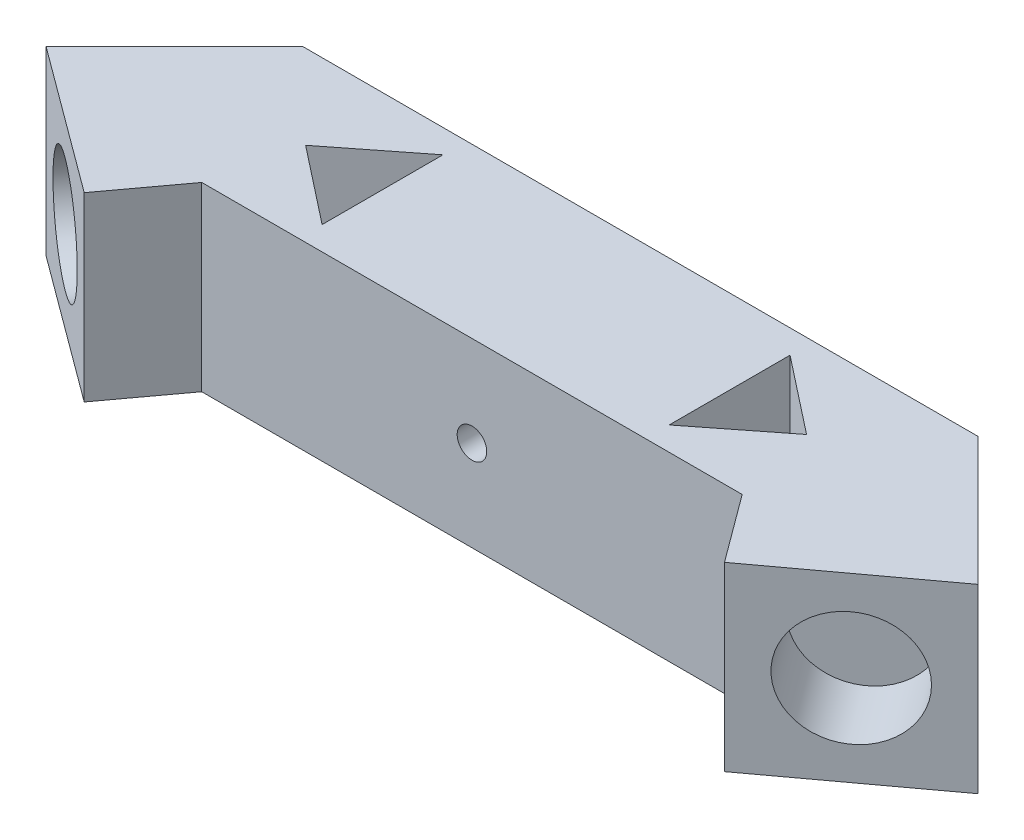
ISO-10303-21;
HEADER;
FILE_DESCRIPTION(('STEP AP214'),'2;1');
FILE_NAME('part.step','',(''),(''),'','','');
FILE_SCHEMA(('AUTOMOTIVE_DESIGN { 1 0 10303 214 1 1 1 1 }'));
ENDSEC;
DATA;
#1=APPLICATION_CONTEXT('core data for automotive mechanical design processes');
#2=APPLICATION_PROTOCOL_DEFINITION('international standard','automotive_design',2000,#1);
#3=PRODUCT_CONTEXT('',#1,'mechanical');
#4=PRODUCT('Part','Part','',(#3));
#5=PRODUCT_RELATED_PRODUCT_CATEGORY('part','',(#4));
#6=PRODUCT_DEFINITION_FORMATION('','',#4);
#7=PRODUCT_DEFINITION_CONTEXT('part definition',#1,'design');
#8=PRODUCT_DEFINITION('design','',#6,#7);
#9=PRODUCT_DEFINITION_SHAPE('','',#8);
#10=(LENGTH_UNIT() NAMED_UNIT(*) SI_UNIT(.MILLI.,.METRE.));
#11=(NAMED_UNIT(*) PLANE_ANGLE_UNIT() SI_UNIT($,.RADIAN.));
#12=(NAMED_UNIT(*) SI_UNIT($,.STERADIAN.) SOLID_ANGLE_UNIT());
#13=UNCERTAINTY_MEASURE_WITH_UNIT(LENGTH_MEASURE(1.E-05),#10,'distance_accuracy_value','');
#14=(GEOMETRIC_REPRESENTATION_CONTEXT(3) GLOBAL_UNCERTAINTY_ASSIGNED_CONTEXT((#13)) GLOBAL_UNIT_ASSIGNED_CONTEXT((#10,
#11,#12)) REPRESENTATION_CONTEXT('',''));
#15=CARTESIAN_POINT('',(0.,0.,0.));
#16=DIRECTION('',(0.,0.,1.));
#17=DIRECTION('',(1.,0.,0.));
#18=AXIS2_PLACEMENT_3D('',#15,#16,#17);
#19=CARTESIAN_POINT('',(0.,38.1,0.));
#20=DIRECTION('',(-0.804595975883322,0.,-0.593822629740873));
#21=DIRECTION('',(-0.593822629740873,0.,0.804595975883322));
#22=AXIS2_PLACEMENT_3D('',#19,#20,#21);
#23=PLANE('',#22);
#24=DIRECTION('',(0.593822629740873,0.,-0.804595975883322));
#25=VECTOR('',#24,1.);
#26=CARTESIAN_POINT('',(0.,0.,0.));
#27=LINE('',#26,#25);
#28=CARTESIAN_POINT('',(-10.4888287779957,0.,14.2117679654397));
#29=VERTEX_POINT('',#28);
#30=CARTESIAN_POINT('',(0.,0.,0.));
#31=VERTEX_POINT('',#30);
#32=EDGE_CURVE('E232',#29,#31,#27,.T.);
#33=ORIENTED_EDGE('',*,*,#32,.T.);
#34=DIRECTION('',(0.,-1.,0.));
#35=VECTOR('',#34,1.);
#36=CARTESIAN_POINT('',(0.,38.1,0.));
#37=LINE('',#36,#35);
#38=CARTESIAN_POINT('',(0.,38.1,0.));
#39=VERTEX_POINT('',#38);
#40=EDGE_CURVE('E11',#39,#31,#37,.T.);
#41=ORIENTED_EDGE('',*,*,#40,.F.);
#42=DIRECTION('',(0.593822629740873,0.,-0.804595975883322));
#43=VECTOR('',#42,1.);
#44=CARTESIAN_POINT('',(0.,38.1,0.));
#45=LINE('',#44,#43);
#46=CARTESIAN_POINT('',(-10.4888287779957,38.1,14.2117679654397));
#47=VERTEX_POINT('',#46);
#48=EDGE_CURVE('E236',#47,#39,#45,.T.);
#49=ORIENTED_EDGE('',*,*,#48,.F.);
#50=DIRECTION('',(0.,-1.,0.));
#51=VECTOR('',#50,1.);
#52=CARTESIAN_POINT('',(-10.4888287779957,38.1,14.2117679654397));
#53=LINE('',#52,#51);
#54=EDGE_CURVE('E262',#47,#29,#53,.T.);
#55=ORIENTED_EDGE('',*,*,#54,.T.);
#56=EDGE_LOOP('',(#33,#41,#49,#55));
#57=FACE_BOUND('',#56,.T.);
#58=ADVANCED_FACE('F45',(#57),#23,.F.);
#59=CARTESIAN_POINT('',(0.,38.1,0.));
#60=DIRECTION('',(0.,0.,-1.));
#61=DIRECTION('',(-1.,0.,0.));
#62=AXIS2_PLACEMENT_3D('',#59,#60,#61);
#63=PLANE('',#62);
#64=CARTESIAN_POINT('',(56.7898329040574,19.05,0.));
#65=DIRECTION('',(0.,0.,-1.));
#66=DIRECTION('',(-1.,0.,0.));
#67=AXIS2_PLACEMENT_3D('',#64,#65,#66);
#68=CIRCLE('',#67,3.1115);
#69=CARTESIAN_POINT('',(53.6783329040574,19.05,0.));
#70=VERTEX_POINT('',#69);
#71=EDGE_CURVE('E174',#70,#70,#68,.T.);
#72=ORIENTED_EDGE('',*,*,#71,.T.);
#73=EDGE_LOOP('',(#72));
#74=FACE_BOUND('',#73,.T.);
#75=DIRECTION('',(1.,0.,0.));
#76=VECTOR('',#75,1.);
#77=CARTESIAN_POINT('',(0.,0.,0.));
#78=LINE('',#77,#76);
#79=CARTESIAN_POINT('',(113.579665808115,0.,0.));
#80=VERTEX_POINT('',#79);
#81=EDGE_CURVE('E266',#31,#80,#78,.T.);
#82=ORIENTED_EDGE('',*,*,#81,.T.);
#83=DIRECTION('',(0.,-1.,0.));
#84=VECTOR('',#83,1.);
#85=CARTESIAN_POINT('',(113.579665808115,38.1,0.));
#86=LINE('',#85,#84);
#87=CARTESIAN_POINT('',(113.579665808115,38.1,0.));
#88=VERTEX_POINT('',#87);
#89=EDGE_CURVE('E53',#88,#80,#86,.T.);
#90=ORIENTED_EDGE('',*,*,#89,.F.);
#91=DIRECTION('',(1.,0.,0.));
#92=VECTOR('',#91,1.);
#93=CARTESIAN_POINT('',(0.,38.1,0.));
#94=LINE('',#93,#92);
#95=EDGE_CURVE('E240',#39,#88,#94,.T.);
#96=ORIENTED_EDGE('',*,*,#95,.F.);
#97=ORIENTED_EDGE('',*,*,#40,.T.);
#98=EDGE_LOOP('',(#82,#90,#96,#97));
#99=FACE_BOUND('',#98,.T.);
#100=ADVANCED_FACE('F336',(#74,#99),#63,.F.);
#101=CARTESIAN_POINT('',(113.579665808115,38.1,0.));
#102=DIRECTION('',(0.804595975883322,0.,-0.593822629740872));
#103=DIRECTION('',(-0.593822629740872,0.,-0.804595975883322));
#104=AXIS2_PLACEMENT_3D('',#101,#102,#103);
#105=PLANE('',#104);
#106=DIRECTION('',(0.593822629740872,0.,0.804595975883322));
#107=VECTOR('',#106,1.);
#108=CARTESIAN_POINT('',(113.579665808115,0.,0.));
#109=LINE('',#108,#107);
#110=CARTESIAN_POINT('',(124.06849458611,0.,14.2117679654397));
#111=VERTEX_POINT('',#110);
#112=EDGE_CURVE('E269',#80,#111,#109,.T.);
#113=ORIENTED_EDGE('',*,*,#112,.T.);
#114=DIRECTION('',(0.,-1.,0.));
#115=VECTOR('',#114,1.);
#116=CARTESIAN_POINT('',(124.06849458611,38.1,14.2117679654397));
#117=LINE('',#116,#115);
#118=CARTESIAN_POINT('',(124.06849458611,38.1,14.2117679654397));
#119=VERTEX_POINT('',#118);
#120=EDGE_CURVE('E305',#119,#111,#117,.T.);
#121=ORIENTED_EDGE('',*,*,#120,.F.);
#122=DIRECTION('',(0.593822629740872,0.,0.804595975883322));
#123=VECTOR('',#122,1.);
#124=CARTESIAN_POINT('',(113.579665808115,38.1,0.));
#125=LINE('',#124,#123);
#126=EDGE_CURVE('E244',#88,#119,#125,.T.);
#127=ORIENTED_EDGE('',*,*,#126,.F.);
#128=ORIENTED_EDGE('',*,*,#89,.T.);
#129=EDGE_LOOP('',(#113,#121,#127,#128));
#130=FACE_BOUND('',#129,.T.);
#131=ADVANCED_FACE('F314',(#130),#105,.F.);
#132=CARTESIAN_POINT('',(154.723601267265,38.1,-8.41287422768753));
#133=DIRECTION('',(-0.593822629740873,0.,-0.804595975883321));
#134=DIRECTION('',(-0.804595975883321,0.,0.593822629740873));
#135=AXIS2_PLACEMENT_3D('',#132,#133,#134);
#136=PLANE('',#135);
#137=CARTESIAN_POINT('',(139.396047926688,19.05,2.8994468688761));
#138=DIRECTION('',(0.593822629740873,0.,0.804595975883321));
#139=DIRECTION('',(0.804595975883321,0.,-0.593822629740873));
#140=AXIS2_PLACEMENT_3D('',#137,#138,#139);
#141=CIRCLE('',#140,12.065);
#142=CARTESIAN_POINT('',(149.10349837572,19.05,-4.26502315894755));
#143=VERTEX_POINT('',#142);
#144=EDGE_CURVE('E186',#143,#143,#141,.T.);
#145=ORIENTED_EDGE('',*,*,#144,.F.);
#146=EDGE_LOOP('',(#145));
#147=FACE_BOUND('',#146,.T.);
#148=DIRECTION('',(0.804595975883321,0.,-0.593822629740873));
#149=VECTOR('',#148,1.);
#150=CARTESIAN_POINT('',(154.723601267265,0.,-8.41287422768753));
#151=LINE('',#150,#149);
#152=CARTESIAN_POINT('',(154.723601267265,0.,-8.41287422768753));
#153=VERTEX_POINT('',#152);
#154=EDGE_CURVE('E272',#111,#153,#151,.T.);
#155=ORIENTED_EDGE('',*,*,#154,.T.);
#156=DIRECTION('',(0.,-1.,0.));
#157=VECTOR('',#156,1.);
#158=CARTESIAN_POINT('',(154.723601267265,38.1,-8.41287422768753));
#159=LINE('',#158,#157);
#160=CARTESIAN_POINT('',(154.723601267265,38.1,-8.41287422768753));
#161=VERTEX_POINT('',#160);
#162=EDGE_CURVE('E301',#161,#153,#159,.T.);
#163=ORIENTED_EDGE('',*,*,#162,.F.);
#164=DIRECTION('',(0.804595975883321,0.,-0.593822629740873));
#165=VECTOR('',#164,1.);
#166=CARTESIAN_POINT('',(154.723601267265,38.1,-8.41287422768753));
#167=LINE('',#166,#165);
#168=EDGE_CURVE('E247',#119,#161,#167,.T.);
#169=ORIENTED_EDGE('',*,*,#168,.F.);
#170=ORIENTED_EDGE('',*,*,#120,.T.);
#171=EDGE_LOOP('',(#155,#163,#169,#170));
#172=FACE_BOUND('',#171,.T.);
#173=ADVANCED_FACE('F324',(#147,#172),#136,.F.);
#174=CARTESIAN_POINT('',(127.782832904057,38.1,-35.3536425908948));
#175=DIRECTION('',(-0.707106781186544,0.,0.707106781186551));
#176=DIRECTION('',(0.707106781186551,0.,0.707106781186544));
#177=AXIS2_PLACEMENT_3D('',#174,#175,#176);
#178=PLANE('',#177);
#179=DIRECTION('',(-0.707106781186551,0.,-0.707106781186544));
#180=VECTOR('',#179,1.);
#181=CARTESIAN_POINT('',(127.782832904057,0.,-35.3536425908948));
#182=LINE('',#181,#180);
#183=CARTESIAN_POINT('',(127.782832904057,0.,-35.3536425908948));
#184=VERTEX_POINT('',#183);
#185=EDGE_CURVE('E275',#153,#184,#182,.T.);
#186=ORIENTED_EDGE('',*,*,#185,.T.);
#187=DIRECTION('',(0.,-1.,0.));
#188=VECTOR('',#187,1.);
#189=CARTESIAN_POINT('',(127.782832904057,38.1,-35.3536425908948));
#190=LINE('',#189,#188);
#191=CARTESIAN_POINT('',(127.782832904057,38.1,-35.3536425908948));
#192=VERTEX_POINT('',#191);
#193=EDGE_CURVE('E297',#192,#184,#190,.T.);
#194=ORIENTED_EDGE('',*,*,#193,.F.);
#195=DIRECTION('',(-0.707106781186551,0.,-0.707106781186544));
#196=VECTOR('',#195,1.);
#197=CARTESIAN_POINT('',(127.782832904057,38.1,-35.3536425908948));
#198=LINE('',#197,#196);
#199=EDGE_CURVE('E250',#161,#192,#198,.T.);
#200=ORIENTED_EDGE('',*,*,#199,.F.);
#201=ORIENTED_EDGE('',*,*,#162,.T.);
#202=EDGE_LOOP('',(#186,#194,#200,#201));
#203=FACE_BOUND('',#202,.T.);
#204=ADVANCED_FACE('F328',(#203),#178,.F.);
#205=CARTESIAN_POINT('',(-14.2031670959426,38.1,-35.3536425908948));
#206=DIRECTION('',(0.,0.,1.));
#207=DIRECTION('',(1.,0.,0.));
#208=AXIS2_PLACEMENT_3D('',#205,#206,#207);
#209=PLANE('',#208);
#210=CARTESIAN_POINT('',(56.7898329040574,19.05,-35.3536425908948));
#211=DIRECTION('',(0.,0.,-1.));
#212=DIRECTION('',(-1.,0.,0.));
#213=AXIS2_PLACEMENT_3D('',#210,#211,#212);
#214=CIRCLE('',#213,3.1115);
#215=CARTESIAN_POINT('',(53.6783329040574,19.05,-35.3536425908948));
#216=VERTEX_POINT('',#215);
#217=EDGE_CURVE('E503',#216,#216,#214,.T.);
#218=ORIENTED_EDGE('',*,*,#217,.F.);
#219=EDGE_LOOP('',(#218));
#220=FACE_BOUND('',#219,.T.);
#221=DIRECTION('',(-1.,0.,0.));
#222=VECTOR('',#221,1.);
#223=CARTESIAN_POINT('',(-14.2031670959426,0.,-35.3536425908948));
#224=LINE('',#223,#222);
#225=CARTESIAN_POINT('',(-14.2031670959426,0.,-35.3536425908948));
#226=VERTEX_POINT('',#225);
#227=EDGE_CURVE('E278',#184,#226,#224,.T.);
#228=ORIENTED_EDGE('',*,*,#227,.T.);
#229=DIRECTION('',(0.,-1.,0.));
#230=VECTOR('',#229,1.);
#231=CARTESIAN_POINT('',(-14.2031670959426,38.1,-35.3536425908948));
#232=LINE('',#231,#230);
#233=CARTESIAN_POINT('',(-14.2031670959426,38.1,-35.3536425908948));
#234=VERTEX_POINT('',#233);
#235=EDGE_CURVE('E293',#234,#226,#232,.T.);
#236=ORIENTED_EDGE('',*,*,#235,.F.);
#237=DIRECTION('',(-1.,0.,0.));
#238=VECTOR('',#237,1.);
#239=CARTESIAN_POINT('',(-14.2031670959426,38.1,-35.3536425908948));
#240=LINE('',#239,#238);
#241=EDGE_CURVE('E253',#192,#234,#240,.T.);
#242=ORIENTED_EDGE('',*,*,#241,.F.);
#243=ORIENTED_EDGE('',*,*,#193,.T.);
#244=EDGE_LOOP('',(#228,#236,#242,#243));
#245=FACE_BOUND('',#244,.T.);
#246=ADVANCED_FACE('F349',(#220,#245),#209,.F.);
#247=CARTESIAN_POINT('',(-14.2031670959426,38.1,-35.3536425908948));
#248=DIRECTION('',(0.707106781186544,0.,0.707106781186551));
#249=DIRECTION('',(0.707106781186551,0.,-0.707106781186544));
#250=AXIS2_PLACEMENT_3D('',#247,#248,#249);
#251=PLANE('',#250);
#252=DIRECTION('',(-0.707106781186551,0.,0.707106781186544));
#253=VECTOR('',#252,1.);
#254=CARTESIAN_POINT('',(-14.2031670959426,0.,-35.3536425908948));
#255=LINE('',#254,#253);
#256=CARTESIAN_POINT('',(-41.1439354591502,0.,-8.41287422768751));
#257=VERTEX_POINT('',#256);
#258=EDGE_CURVE('E281',#226,#257,#255,.T.);
#259=ORIENTED_EDGE('',*,*,#258,.T.);
#260=DIRECTION('',(0.,-1.,0.));
#261=VECTOR('',#260,1.);
#262=CARTESIAN_POINT('',(-41.1439354591502,38.1,-8.41287422768751));
#263=LINE('',#262,#261);
#264=CARTESIAN_POINT('',(-41.1439354591502,38.1,-8.41287422768751));
#265=VERTEX_POINT('',#264);
#266=EDGE_CURVE('E289',#265,#257,#263,.T.);
#267=ORIENTED_EDGE('',*,*,#266,.F.);
#268=DIRECTION('',(-0.707106781186551,0.,0.707106781186544));
#269=VECTOR('',#268,1.);
#270=CARTESIAN_POINT('',(-14.2031670959426,38.1,-35.3536425908948));
#271=LINE('',#270,#269);
#272=EDGE_CURVE('E256',#234,#265,#271,.T.);
#273=ORIENTED_EDGE('',*,*,#272,.F.);
#274=ORIENTED_EDGE('',*,*,#235,.T.);
#275=EDGE_LOOP('',(#259,#267,#273,#274));
#276=FACE_BOUND('',#275,.T.);
#277=ADVANCED_FACE('F347',(#276),#251,.F.);
#278=CARTESIAN_POINT('',(-41.1439354591502,38.1,-8.41287422768751));
#279=DIRECTION('',(0.593822629740873,0.,-0.804595975883321));
#280=DIRECTION('',(-0.804595975883322,0.,-0.593822629740873));
#281=AXIS2_PLACEMENT_3D('',#278,#279,#280);
#282=PLANE('',#281);
#283=CARTESIAN_POINT('',(-25.816382118573,19.05,2.89944686887611));
#284=DIRECTION('',(-0.593822629740873,0.,0.804595975883321));
#285=DIRECTION('',(0.804595975883321,0.,0.593822629740873));
#286=AXIS2_PLACEMENT_3D('',#283,#284,#285);
#287=CIRCLE('',#286,12.065);
#288=CARTESIAN_POINT('',(-16.1089316695407,19.05,10.0639168966997));
#289=VERTEX_POINT('',#288);
#290=EDGE_CURVE('E224',#289,#289,#287,.T.);
#291=ORIENTED_EDGE('',*,*,#290,.F.);
#292=EDGE_LOOP('',(#291));
#293=FACE_BOUND('',#292,.T.);
#294=DIRECTION('',(0.804595975883322,0.,0.593822629740873));
#295=VECTOR('',#294,1.);
#296=CARTESIAN_POINT('',(-41.1439354591502,0.,-8.41287422768751));
#297=LINE('',#296,#295);
#298=EDGE_CURVE('E241',#257,#29,#297,.T.);
#299=ORIENTED_EDGE('',*,*,#298,.T.);
#300=ORIENTED_EDGE('',*,*,#54,.F.);
#301=DIRECTION('',(0.804595975883322,0.,0.593822629740873));
#302=VECTOR('',#301,1.);
#303=CARTESIAN_POINT('',(-41.1439354591502,38.1,-8.41287422768751));
#304=LINE('',#303,#302);
#305=EDGE_CURVE('E259',#265,#47,#304,.T.);
#306=ORIENTED_EDGE('',*,*,#305,.F.);
#307=ORIENTED_EDGE('',*,*,#266,.T.);
#308=EDGE_LOOP('',(#299,#300,#306,#307));
#309=FACE_BOUND('',#308,.T.);
#310=ADVANCED_FACE('F342',(#293,#309),#282,.F.);
#311=CARTESIAN_POINT('',(0.,38.1,0.));
#312=DIRECTION('',(0.,1.,0.));
#313=DIRECTION('',(0.,0.,1.));
#314=AXIS2_PLACEMENT_3D('',#311,#312,#313);
#315=PLANE('',#314);
#316=DIRECTION('',(0.786407597023069,0.,0.617707933690674));
#317=VECTOR('',#316,1.);
#318=CARTESIAN_POINT('',(20.32,38.1,-4.97682129544743));
#319=LINE('',#318,#317);
#320=CARTESIAN_POINT('',(4.15155543669238,38.1,-17.6768212954474));
#321=VERTEX_POINT('',#320);
#322=CARTESIAN_POINT('',(20.32,38.1,-4.97682129544743));
#323=VERTEX_POINT('',#322);
#324=EDGE_CURVE('E60',#321,#323,#319,.T.);
#325=ORIENTED_EDGE('',*,*,#324,.F.);
#326=DIRECTION('',(-0.786407597023069,0.,0.617707933690674));
#327=VECTOR('',#326,1.);
#328=CARTESIAN_POINT('',(4.15155543669238,38.1,-17.6768212954474));
#329=LINE('',#328,#327);
#330=CARTESIAN_POINT('',(20.32,38.1,-30.3768212954474));
#331=VERTEX_POINT('',#330);
#332=EDGE_CURVE('E167',#331,#321,#329,.T.);
#333=ORIENTED_EDGE('',*,*,#332,.F.);
#334=DIRECTION('',(0.,0.,-1.));
#335=VECTOR('',#334,1.);
#336=CARTESIAN_POINT('',(20.32,38.1,-30.3768212954474));
#337=LINE('',#336,#335);
#338=EDGE_CURVE('E171',#323,#331,#337,.T.);
#339=ORIENTED_EDGE('',*,*,#338,.F.);
#340=EDGE_LOOP('',(#325,#333,#339));
#341=FACE_BOUND('',#340,.T.);
#342=DIRECTION('',(-0.786407597023069,0.,-0.617707933690674));
#343=VECTOR('',#342,1.);
#344=CARTESIAN_POINT('',(109.428110371422,38.1,-17.6768212954474));
#345=LINE('',#344,#343);
#346=CARTESIAN_POINT('',(109.428110371422,38.1,-17.6768212954474));
#347=VERTEX_POINT('',#346);
#348=CARTESIAN_POINT('',(93.2596658081147,38.1,-30.3768212954474));
#349=VERTEX_POINT('',#348);
#350=EDGE_CURVE('E68',#347,#349,#345,.T.);
#351=ORIENTED_EDGE('',*,*,#350,.F.);
#352=DIRECTION('',(0.786407597023068,0.,-0.617707933690675));
#353=VECTOR('',#352,1.);
#354=CARTESIAN_POINT('',(93.2596658081148,38.1,-4.97682129544743));
#355=LINE('',#354,#353);
#356=CARTESIAN_POINT('',(93.2596658081148,38.1,-4.97682129544743));
#357=VERTEX_POINT('',#356);
#358=EDGE_CURVE('E199',#357,#347,#355,.T.);
#359=ORIENTED_EDGE('',*,*,#358,.F.);
#360=DIRECTION('',(0.,0.,1.));
#361=VECTOR('',#360,1.);
#362=CARTESIAN_POINT('',(93.2596658081147,38.1,-30.3768212954474));
#363=LINE('',#362,#361);
#364=EDGE_CURVE('E203',#349,#357,#363,.T.);
#365=ORIENTED_EDGE('',*,*,#364,.F.);
#366=EDGE_LOOP('',(#351,#359,#365));
#367=FACE_BOUND('',#366,.T.);
#368=ORIENTED_EDGE('',*,*,#48,.T.);
#369=ORIENTED_EDGE('',*,*,#95,.T.);
#370=ORIENTED_EDGE('',*,*,#126,.T.);
#371=ORIENTED_EDGE('',*,*,#168,.T.);
#372=ORIENTED_EDGE('',*,*,#199,.T.);
#373=ORIENTED_EDGE('',*,*,#241,.T.);
#374=ORIENTED_EDGE('',*,*,#272,.T.);
#375=ORIENTED_EDGE('',*,*,#305,.T.);
#376=EDGE_LOOP('',(#368,#369,#370,#371,#372,#373,#374,#375));
#377=FACE_BOUND('',#376,.T.);
#378=ADVANCED_FACE('F332',(#341,#367,#377),#315,.T.);
#379=CARTESIAN_POINT('',(0.,0.,0.));
#380=DIRECTION('',(0.,1.,0.));
#381=DIRECTION('',(0.,0.,1.));
#382=AXIS2_PLACEMENT_3D('',#379,#380,#381);
#383=PLANE('',#382);
#384=DIRECTION('',(-0.786407597023069,0.,0.617707933690674));
#385=VECTOR('',#384,1.);
#386=CARTESIAN_POINT('',(4.15155543669238,0.,-17.6768212954474));
#387=LINE('',#386,#385);
#388=CARTESIAN_POINT('',(20.32,0.,-30.3768212954474));
#389=VERTEX_POINT('',#388);
#390=CARTESIAN_POINT('',(4.15155543669238,0.,-17.6768212954474));
#391=VERTEX_POINT('',#390);
#392=EDGE_CURVE('E155',#389,#391,#387,.T.);
#393=ORIENTED_EDGE('',*,*,#392,.T.);
#394=DIRECTION('',(0.786407597023069,0.,0.617707933690674));
#395=VECTOR('',#394,1.);
#396=CARTESIAN_POINT('',(20.32,0.,-4.97682129544743));
#397=LINE('',#396,#395);
#398=CARTESIAN_POINT('',(20.32,0.,-4.97682129544743));
#399=VERTEX_POINT('',#398);
#400=EDGE_CURVE('E148',#391,#399,#397,.T.);
#401=ORIENTED_EDGE('',*,*,#400,.T.);
#402=DIRECTION('',(0.,0.,-1.));
#403=VECTOR('',#402,1.);
#404=CARTESIAN_POINT('',(20.32,0.,-30.3768212954474));
#405=LINE('',#404,#403);
#406=EDGE_CURVE('E159',#399,#389,#405,.T.);
#407=ORIENTED_EDGE('',*,*,#406,.T.);
#408=EDGE_LOOP('',(#393,#401,#407));
#409=FACE_BOUND('',#408,.T.);
#410=DIRECTION('',(0.786407597023068,0.,-0.617707933690675));
#411=VECTOR('',#410,1.);
#412=CARTESIAN_POINT('',(93.2596658081148,0.,-4.97682129544743));
#413=LINE('',#412,#411);
#414=CARTESIAN_POINT('',(93.2596658081148,0.,-4.97682129544743));
#415=VERTEX_POINT('',#414);
#416=CARTESIAN_POINT('',(109.428110371422,0.,-17.6768212954474));
#417=VERTEX_POINT('',#416);
#418=EDGE_CURVE('E192',#415,#417,#413,.T.);
#419=ORIENTED_EDGE('',*,*,#418,.T.);
#420=DIRECTION('',(-0.786407597023069,0.,-0.617707933690674));
#421=VECTOR('',#420,1.);
#422=CARTESIAN_POINT('',(109.428110371422,0.,-17.6768212954474));
#423=LINE('',#422,#421);
#424=CARTESIAN_POINT('',(93.2596658081147,0.,-30.3768212954474));
#425=VERTEX_POINT('',#424);
#426=EDGE_CURVE('E204',#417,#425,#423,.T.);
#427=ORIENTED_EDGE('',*,*,#426,.T.);
#428=DIRECTION('',(0.,0.,1.));
#429=VECTOR('',#428,1.);
#430=CARTESIAN_POINT('',(93.2596658081147,0.,-30.3768212954474));
#431=LINE('',#430,#429);
#432=EDGE_CURVE('E213',#425,#415,#431,.T.);
#433=ORIENTED_EDGE('',*,*,#432,.T.);
#434=EDGE_LOOP('',(#419,#427,#433));
#435=FACE_BOUND('',#434,.T.);
#436=ORIENTED_EDGE('',*,*,#32,.F.);
#437=ORIENTED_EDGE('',*,*,#298,.F.);
#438=ORIENTED_EDGE('',*,*,#258,.F.);
#439=ORIENTED_EDGE('',*,*,#227,.F.);
#440=ORIENTED_EDGE('',*,*,#185,.F.);
#441=ORIENTED_EDGE('',*,*,#154,.F.);
#442=ORIENTED_EDGE('',*,*,#112,.F.);
#443=ORIENTED_EDGE('',*,*,#81,.F.);
#444=EDGE_LOOP('',(#436,#437,#438,#439,#440,#441,#442,#443));
#445=FACE_BOUND('',#444,.T.);
#446=ADVANCED_FACE('F164',(#409,#435,#445),#383,.F.);
#447=CARTESIAN_POINT('',(-16.7665252413221,19.05,-9.36259580358571));
#448=DIRECTION('',(-0.593822629740873,0.,0.804595975883321));
#449=DIRECTION('',(0.804595975883322,0.,0.593822629740873));
#450=AXIS2_PLACEMENT_3D('',#447,#448,#449);
#451=CYLINDRICAL_SURFACE('',#450,12.065);
#452=CARTESIAN_POINT('',(-16.7665252413221,19.05,-9.36259580358571));
#453=DIRECTION('',(-0.593822629740873,0.,0.804595975883321));
#454=DIRECTION('',(0.804595975883321,0.,0.593822629740873));
#455=AXIS2_PLACEMENT_3D('',#452,#453,#454);
#456=CIRCLE('',#455,12.065);
#457=CARTESIAN_POINT('',(-7.0590747922898,19.05,-2.19812577576208));
#458=VERTEX_POINT('',#457);
#459=EDGE_CURVE('E228',#458,#458,#456,.T.);
#460=ORIENTED_EDGE('',*,*,#459,.F.);
#461=EDGE_LOOP('',(#460));
#462=FACE_BOUND('',#461,.T.);
#463=ORIENTED_EDGE('',*,*,#290,.T.);
#464=EDGE_LOOP('',(#463));
#465=FACE_BOUND('',#464,.T.);
#466=ADVANCED_FACE('F392',(#462,#465),#451,.F.);
#467=CARTESIAN_POINT('',(-16.7665252413221,19.05,-9.36259580358571));
#468=DIRECTION('',(-0.593822629740873,0.,0.804595975883321));
#469=DIRECTION('',(0.804595975883321,0.,0.593822629740873));
#470=AXIS2_PLACEMENT_3D('',#467,#468,#469);
#471=PLANE('',#470);
#472=ORIENTED_EDGE('',*,*,#459,.T.);
#473=EDGE_LOOP('',(#472));
#474=FACE_BOUND('',#473,.T.);
#475=ADVANCED_FACE('F383',(#474),#471,.T.);
#476=CARTESIAN_POINT('',(130.346191049437,19.05,-9.36259580358572));
#477=DIRECTION('',(0.593822629740873,0.,0.804595975883321));
#478=DIRECTION('',(0.804595975883321,0.,-0.593822629740873));
#479=AXIS2_PLACEMENT_3D('',#476,#477,#478);
#480=CYLINDRICAL_SURFACE('',#479,12.065);
#481=CARTESIAN_POINT('',(130.346191049437,19.05,-9.36259580358572));
#482=DIRECTION('',(0.593822629740873,0.,0.804595975883321));
#483=DIRECTION('',(0.804595975883321,0.,-0.593822629740873));
#484=AXIS2_PLACEMENT_3D('',#481,#482,#483);
#485=CIRCLE('',#484,12.065);
#486=CARTESIAN_POINT('',(140.053641498469,19.05,-16.5270658314094));
#487=VERTEX_POINT('',#486);
#488=EDGE_CURVE('E220',#487,#487,#485,.T.);
#489=ORIENTED_EDGE('',*,*,#488,.F.);
#490=EDGE_LOOP('',(#489));
#491=FACE_BOUND('',#490,.T.);
#492=ORIENTED_EDGE('',*,*,#144,.T.);
#493=EDGE_LOOP('',(#492));
#494=FACE_BOUND('',#493,.T.);
#495=ADVANCED_FACE('F381',(#491,#494),#480,.F.);
#496=CARTESIAN_POINT('',(130.346191049437,19.05,-9.36259580358572));
#497=DIRECTION('',(0.593822629740873,0.,0.804595975883321));
#498=DIRECTION('',(0.804595975883321,0.,-0.593822629740873));
#499=AXIS2_PLACEMENT_3D('',#496,#497,#498);
#500=PLANE('',#499);
#501=ORIENTED_EDGE('',*,*,#488,.T.);
#502=EDGE_LOOP('',(#501));
#503=FACE_BOUND('',#502,.T.);
#504=ADVANCED_FACE('F382',(#503),#500,.T.);
#505=CARTESIAN_POINT('',(109.428110371422,0.,-17.6768212954474));
#506=DIRECTION('',(0.617707933690674,0.,-0.786407597023069));
#507=DIRECTION('',(-0.786407597023069,0.,-0.617707933690674));
#508=AXIS2_PLACEMENT_3D('',#505,#506,#507);
#509=PLANE('',#508);
#510=ORIENTED_EDGE('',*,*,#350,.T.);
#511=DIRECTION('',(0.,1.,0.));
#512=VECTOR('',#511,1.);
#513=CARTESIAN_POINT('',(93.2596658081147,0.,-30.3768212954474));
#514=LINE('',#513,#512);
#515=EDGE_CURVE('E189',#425,#349,#514,.T.);
#516=ORIENTED_EDGE('',*,*,#515,.F.);
#517=ORIENTED_EDGE('',*,*,#426,.F.);
#518=DIRECTION('',(0.,1.,0.));
#519=VECTOR('',#518,1.);
#520=CARTESIAN_POINT('',(109.428110371422,0.,-17.6768212954474));
#521=LINE('',#520,#519);
#522=EDGE_CURVE('E196',#417,#347,#521,.T.);
#523=ORIENTED_EDGE('',*,*,#522,.T.);
#524=EDGE_LOOP('',(#510,#516,#517,#523));
#525=FACE_BOUND('',#524,.T.);
#526=ADVANCED_FACE('F389',(#525),#509,.F.);
#527=CARTESIAN_POINT('',(93.2596658081148,0.,-4.97682129544743));
#528=DIRECTION('',(0.617707933690675,0.,0.786407597023068));
#529=DIRECTION('',(0.786407597023068,0.,-0.617707933690675));
#530=AXIS2_PLACEMENT_3D('',#527,#528,#529);
#531=PLANE('',#530);
#532=ORIENTED_EDGE('',*,*,#358,.T.);
#533=ORIENTED_EDGE('',*,*,#522,.F.);
#534=ORIENTED_EDGE('',*,*,#418,.F.);
#535=DIRECTION('',(0.,1.,0.));
#536=VECTOR('',#535,1.);
#537=CARTESIAN_POINT('',(93.2596658081148,0.,-4.97682129544743));
#538=LINE('',#537,#536);
#539=EDGE_CURVE('E193',#415,#357,#538,.T.);
#540=ORIENTED_EDGE('',*,*,#539,.T.);
#541=EDGE_LOOP('',(#532,#533,#534,#540));
#542=FACE_BOUND('',#541,.T.);
#543=ADVANCED_FACE('F446',(#542),#531,.F.);
#544=CARTESIAN_POINT('',(93.2596658081147,0.,-30.3768212954474));
#545=DIRECTION('',(-1.,0.,0.));
#546=DIRECTION('',(0.,0.,1.));
#547=AXIS2_PLACEMENT_3D('',#544,#545,#546);
#548=PLANE('',#547);
#549=ORIENTED_EDGE('',*,*,#364,.T.);
#550=ORIENTED_EDGE('',*,*,#539,.F.);
#551=ORIENTED_EDGE('',*,*,#432,.F.);
#552=ORIENTED_EDGE('',*,*,#515,.T.);
#553=EDGE_LOOP('',(#549,#550,#551,#552));
#554=FACE_BOUND('',#553,.T.);
#555=ADVANCED_FACE('F455',(#554),#548,.F.);
#556=CARTESIAN_POINT('',(20.32,0.,-4.97682129544743));
#557=DIRECTION('',(-0.617707933690675,0.,0.786407597023069));
#558=DIRECTION('',(0.786407597023069,0.,0.617707933690674));
#559=AXIS2_PLACEMENT_3D('',#556,#557,#558);
#560=PLANE('',#559);
#561=ORIENTED_EDGE('',*,*,#324,.T.);
#562=DIRECTION('',(0.,1.,0.));
#563=VECTOR('',#562,1.);
#564=CARTESIAN_POINT('',(20.32,0.,-4.97682129544743));
#565=LINE('',#564,#563);
#566=EDGE_CURVE('E144',#399,#323,#565,.T.);
#567=ORIENTED_EDGE('',*,*,#566,.F.);
#568=ORIENTED_EDGE('',*,*,#400,.F.);
#569=DIRECTION('',(0.,1.,0.));
#570=VECTOR('',#569,1.);
#571=CARTESIAN_POINT('',(4.15155543669238,0.,-17.6768212954474));
#572=LINE('',#571,#570);
#573=EDGE_CURVE('E183',#391,#321,#572,.T.);
#574=ORIENTED_EDGE('',*,*,#573,.T.);
#575=EDGE_LOOP('',(#561,#567,#568,#574));
#576=FACE_BOUND('',#575,.T.);
#577=ADVANCED_FACE('F146',(#576),#560,.F.);
#578=CARTESIAN_POINT('',(4.15155543669238,0.,-17.6768212954474));
#579=DIRECTION('',(-0.617707933690675,0.,-0.786407597023069));
#580=DIRECTION('',(-0.786407597023069,0.,0.617707933690674));
#581=AXIS2_PLACEMENT_3D('',#578,#579,#580);
#582=PLANE('',#581);
#583=ORIENTED_EDGE('',*,*,#332,.T.);
#584=ORIENTED_EDGE('',*,*,#573,.F.);
#585=ORIENTED_EDGE('',*,*,#392,.F.);
#586=DIRECTION('',(0.,1.,0.));
#587=VECTOR('',#586,1.);
#588=CARTESIAN_POINT('',(20.32,0.,-30.3768212954474));
#589=LINE('',#588,#587);
#590=EDGE_CURVE('E154',#389,#331,#589,.T.);
#591=ORIENTED_EDGE('',*,*,#590,.T.);
#592=EDGE_LOOP('',(#583,#584,#585,#591));
#593=FACE_BOUND('',#592,.T.);
#594=ADVANCED_FACE('F473',(#593),#582,.F.);
#595=CARTESIAN_POINT('',(20.32,0.,-30.3768212954474));
#596=DIRECTION('',(1.,0.,0.));
#597=DIRECTION('',(0.,0.,-1.));
#598=AXIS2_PLACEMENT_3D('',#595,#596,#597);
#599=PLANE('',#598);
#600=ORIENTED_EDGE('',*,*,#338,.T.);
#601=ORIENTED_EDGE('',*,*,#590,.F.);
#602=ORIENTED_EDGE('',*,*,#406,.F.);
#603=ORIENTED_EDGE('',*,*,#566,.T.);
#604=EDGE_LOOP('',(#600,#601,#602,#603));
#605=FACE_BOUND('',#604,.T.);
#606=ADVANCED_FACE('F160',(#605),#599,.F.);
#607=CARTESIAN_POINT('',(56.7898329040574,19.05,11.1283574091052));
#608=DIRECTION('',(0.,0.,-1.));
#609=DIRECTION('',(-1.,0.,0.));
#610=AXIS2_PLACEMENT_3D('',#607,#608,#609);
#611=CYLINDRICAL_SURFACE('',#610,3.1115);
#612=CARTESIAN_POINT('',(53.6783329040574,19.05,-35.3536425908948));
#613=CARTESIAN_POINT('',(53.6783329040574,19.05,-34.985375480573));
#614=CARTESIAN_POINT('',(53.6783329040574,19.05,-34.6171083702512));
#615=CARTESIAN_POINT('',(53.6783329040574,19.05,-33.8805741496075));
#616=CARTESIAN_POINT('',(53.6783329040574,19.05,-33.5123070392857));
#617=CARTESIAN_POINT('',(53.6783329040574,19.05,-32.7757728186421));
#618=CARTESIAN_POINT('',(53.6783329040574,19.05,-32.4075057083203));
#619=CARTESIAN_POINT('',(53.6783329040574,19.05,-31.6709714876766));
#620=CARTESIAN_POINT('',(53.6783329040574,19.05,-31.3027043773548));
#621=CARTESIAN_POINT('',(53.6783329040574,19.05,-30.5661701567112));
#622=CARTESIAN_POINT('',(53.6783329040574,19.05,-30.1979030463893));
#623=CARTESIAN_POINT('',(53.6783329040574,19.05,-29.4613688257457));
#624=CARTESIAN_POINT('',(53.6783329040574,19.05,-29.0931017154239));
#625=CARTESIAN_POINT('',(53.6783329040574,19.05,-28.3565674947802));
#626=CARTESIAN_POINT('',(53.6783329040574,19.05,-27.9883003844584));
#627=CARTESIAN_POINT('',(53.6783329040574,19.05,-27.2517661638148));
#628=CARTESIAN_POINT('',(53.6783329040574,19.05,-26.8834990534929));
#629=CARTESIAN_POINT('',(53.6783329040574,19.05,-26.1469648328493));
#630=CARTESIAN_POINT('',(53.6783329040574,19.05,-25.7786977225275));
#631=CARTESIAN_POINT('',(53.6783329040574,19.05,-25.0421635018838));
#632=CARTESIAN_POINT('',(53.6783329040574,19.05,-24.673896391562));
#633=CARTESIAN_POINT('',(53.6783329040574,19.05,-23.9373621709184));
#634=CARTESIAN_POINT('',(53.6783329040574,19.05,-23.5690950605966));
#635=CARTESIAN_POINT('',(53.6783329040574,19.05,-22.8325608399529));
#636=CARTESIAN_POINT('',(53.6783329040574,19.05,-22.4642937296311));
#637=CARTESIAN_POINT('',(53.6783329040574,19.05,-21.7277595089874));
#638=CARTESIAN_POINT('',(53.6783329040574,19.05,-21.3594923986656));
#639=CARTESIAN_POINT('',(53.6783329040574,19.05,-20.622958178022));
#640=CARTESIAN_POINT('',(53.6783329040574,19.05,-20.2546910677002));
#641=CARTESIAN_POINT('',(53.6783329040574,19.05,-19.5181568470565));
#642=CARTESIAN_POINT('',(53.6783329040574,19.05,-19.1498897367347));
#643=CARTESIAN_POINT('',(53.6783329040574,19.05,-18.4133555160911));
#644=CARTESIAN_POINT('',(53.6783329040574,19.05,-18.0450884057692));
#645=CARTESIAN_POINT('',(53.6783329040574,19.05,-17.3085541851256));
#646=CARTESIAN_POINT('',(53.6783329040574,19.05,-16.9402870748038));
#647=CARTESIAN_POINT('',(53.6783329040574,19.05,-16.2037528541601));
#648=CARTESIAN_POINT('',(53.6783329040574,19.05,-15.8354857438383));
#649=CARTESIAN_POINT('',(53.6783329040574,19.05,-15.0989515231947));
#650=CARTESIAN_POINT('',(53.6783329040574,19.05,-14.7306844128728));
#651=CARTESIAN_POINT('',(53.6783329040574,19.05,-13.9941501922292));
#652=CARTESIAN_POINT('',(53.6783329040574,19.05,-13.6258830819074));
#653=CARTESIAN_POINT('',(53.6783329040574,19.05,-12.8893488612637));
#654=CARTESIAN_POINT('',(53.6783329040574,19.05,-12.5210817509419));
#655=CARTESIAN_POINT('',(53.6783329040574,19.05,-11.7845475302983));
#656=CARTESIAN_POINT('',(53.6783329040574,19.05,-11.4162804199765));
#657=CARTESIAN_POINT('',(53.6783329040574,19.05,-10.6797461993328));
#658=CARTESIAN_POINT('',(53.6783329040574,19.05,-10.311479089011));
#659=CARTESIAN_POINT('',(53.6783329040574,19.05,-9.57494486836735));
#660=CARTESIAN_POINT('',(53.6783329040574,19.05,-9.20667775804553));
#661=CARTESIAN_POINT('',(53.6783329040574,19.05,-8.47014353740189));
#662=CARTESIAN_POINT('',(53.6783329040574,19.05,-8.10187642708007));
#663=CARTESIAN_POINT('',(53.6783329040574,19.05,-7.36534220643643));
#664=CARTESIAN_POINT('',(53.6783329040574,19.05,-6.9970750961146));
#665=CARTESIAN_POINT('',(53.6783329040574,19.05,-6.26054087547096));
#666=CARTESIAN_POINT('',(53.6783329040574,19.05,-5.89227376514914));
#667=CARTESIAN_POINT('',(53.6783329040574,19.05,-5.1557395445055));
#668=CARTESIAN_POINT('',(53.6783329040574,19.05,-4.78747243418368));
#669=CARTESIAN_POINT('',(53.6783329040574,19.05,-4.05093821354004));
#670=CARTESIAN_POINT('',(53.6783329040574,19.05,-3.68267110321822));
#671=CARTESIAN_POINT('',(53.6783329040574,19.05,-2.94613688257457));
#672=CARTESIAN_POINT('',(53.6783329040574,19.05,-2.57786977225275));
#673=CARTESIAN_POINT('',(53.6783329040574,19.05,-1.84133555160911));
#674=CARTESIAN_POINT('',(53.6783329040574,19.05,-1.47306844128729));
#675=CARTESIAN_POINT('',(53.6783329040574,19.05,-0.736534220643649));
#676=CARTESIAN_POINT('',(53.6783329040574,19.05,-0.368267110321827));
#677=CARTESIAN_POINT('',(53.6783329040574,19.05,0.));
#678=B_SPLINE_CURVE_WITH_KNOTS('',3,(#612,#613,#614,#615,#616,#617,#618,#619,#620,#621,#622,
#623,#624,#625,#626,#627,#628,#629,#630,#631,#632,#633,#634,#635,#636,#637,#638,#639,#640,#641,
#642,#643,#644,#645,#646,#647,#648,#649,#650,#651,#652,#653,#654,#655,#656,#657,#658,#659,#660,
#661,#662,#663,#664,#665,#666,#667,#668,#669,#670,#671,#672,#673,#674,#675,#676,#677),
.UNSPECIFIED.,.F.,.F.,(4,2,2,2,2,2,2,2,2,2,2,2,2,2,2,2,2,2,2,2,2,2,2,2,2,2,2,2,2,2,2,2,4),(0.,
1.10480133096547,2.20960266193092,3.31440399289639,4.41920532386186,5.52400665482732,
6.62880798579278,7.73360931675825,8.83841064772371,9.94321197868917,11.0480133096546,
12.1528146406201,13.2576159715856,14.362417302551,15.4672186335165,16.5720199644819,
17.6768212954474,18.7816226264129,19.8864239573783,20.9912252883438,22.0960266193093,
23.2008279502747,24.3056292812402,25.4104306122057,26.5152319431711,27.6200332741366,
28.724834605102,29.8296359360675,30.934437267033,32.0392385979984,33.1440399289639,
34.2488412599294,35.3536425908948),.UNSPECIFIED.);
#679=EDGE_CURVE('BSEAM490',#216,#70,#678,.T.);
#680=ORIENTED_EDGE('',*,*,#217,.T.);
#681=ORIENTED_EDGE('',*,*,#71,.F.);
#682=ORIENTED_EDGE('',*,*,#679,.T.);
#683=ORIENTED_EDGE('',*,*,#679,.F.);
#684=EDGE_LOOP('',(#680,#682,#681,#683));
#685=FACE_BOUND('',#684,.T.);
#686=ADVANCED_FACE('F490',(#685),#611,.F.);
#687=CLOSED_SHELL('',(#58,#100,#131,#173,#204,#246,#277,#310,#378,#446,#466,#475,#495,#504,#526,
#543,#555,#577,#594,#606,#686));
#688=MANIFOLD_SOLID_BREP('B2',#687);
#689=ADVANCED_BREP_SHAPE_REPRESENTATION('',(#18,#688),#14);
#690=SHAPE_DEFINITION_REPRESENTATION(#9,#689);
ENDSEC;
END-ISO-10303-21;
